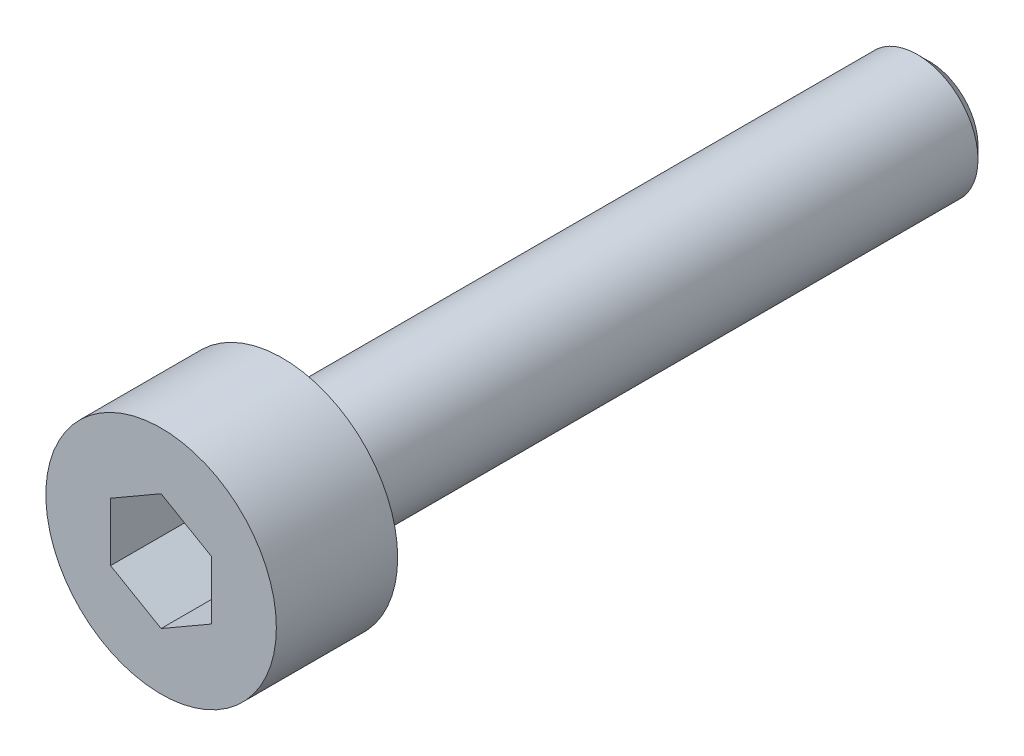
ISO-10303-21;
HEADER;
FILE_DESCRIPTION(('STEP AP214'),'2;1');
FILE_NAME('part.step','',(''),(''),'','','');
FILE_SCHEMA(('AUTOMOTIVE_DESIGN { 1 0 10303 214 1 1 1 1 }'));
ENDSEC;
DATA;
#1=APPLICATION_CONTEXT('core data for automotive mechanical design processes');
#2=APPLICATION_PROTOCOL_DEFINITION('international standard','automotive_design',2000,#1);
#3=PRODUCT_CONTEXT('',#1,'mechanical');
#4=PRODUCT('Part','Part','',(#3));
#5=PRODUCT_RELATED_PRODUCT_CATEGORY('part','',(#4));
#6=PRODUCT_DEFINITION_FORMATION('','',#4);
#7=PRODUCT_DEFINITION_CONTEXT('part definition',#1,'design');
#8=PRODUCT_DEFINITION('design','',#6,#7);
#9=PRODUCT_DEFINITION_SHAPE('','',#8);
#10=(LENGTH_UNIT() NAMED_UNIT(*) SI_UNIT(.MILLI.,.METRE.));
#11=(NAMED_UNIT(*) PLANE_ANGLE_UNIT() SI_UNIT($,.RADIAN.));
#12=(NAMED_UNIT(*) SI_UNIT($,.STERADIAN.) SOLID_ANGLE_UNIT());
#13=UNCERTAINTY_MEASURE_WITH_UNIT(LENGTH_MEASURE(1.E-05),#10,'distance_accuracy_value','');
#14=(GEOMETRIC_REPRESENTATION_CONTEXT(3) GLOBAL_UNCERTAINTY_ASSIGNED_CONTEXT((#13)) GLOBAL_UNIT_ASSIGNED_CONTEXT((#10,
#11,#12)) REPRESENTATION_CONTEXT('',''));
#15=CARTESIAN_POINT('',(0.,0.,0.));
#16=DIRECTION('',(0.,0.,1.));
#17=DIRECTION('',(1.,0.,0.));
#18=AXIS2_PLACEMENT_3D('',#15,#16,#17);
#19=CARTESIAN_POINT('',(0.,0.,0.));
#20=DIRECTION('',(0.,0.,1.));
#21=DIRECTION('',(1.,0.,0.));
#22=AXIS2_PLACEMENT_3D('',#19,#20,#21);
#23=PLANE('',#22);
#24=CARTESIAN_POINT('',(0.,0.,0.));
#25=DIRECTION('',(0.,0.,1.));
#26=DIRECTION('',(1.,0.,0.));
#27=AXIS2_PLACEMENT_3D('',#24,#25,#26);
#28=CIRCLE('',#27,2.85);
#29=CARTESIAN_POINT('',(2.85,0.,0.));
#30=VERTEX_POINT('',#29);
#31=EDGE_CURVE('E138',#30,#30,#28,.T.);
#32=ORIENTED_EDGE('',*,*,#31,.F.);
#33=EDGE_LOOP('',(#32));
#34=FACE_BOUND('',#33,.T.);
#35=CARTESIAN_POINT('',(0.,0.,0.));
#36=DIRECTION('',(0.,0.,1.));
#37=DIRECTION('',(1.,0.,0.));
#38=AXIS2_PLACEMENT_3D('',#35,#36,#37);
#39=CIRCLE('',#38,1.5);
#40=CARTESIAN_POINT('',(1.5,0.,0.));
#41=VERTEX_POINT('',#40);
#42=EDGE_CURVE('E147',#41,#41,#39,.F.);
#43=ORIENTED_EDGE('',*,*,#42,.F.);
#44=EDGE_LOOP('',(#43));
#45=FACE_BOUND('',#44,.T.);
#46=ADVANCED_FACE('F36',(#34,#45),#23,.F.);
#47=CARTESIAN_POINT('',(0.,0.,3.));
#48=DIRECTION('',(0.,0.,-1.));
#49=DIRECTION('',(-1.,0.,0.));
#50=AXIS2_PLACEMENT_3D('',#47,#48,#49);
#51=CYLINDRICAL_SURFACE('',#50,2.85);
#52=CARTESIAN_POINT('',(0.,0.,3.));
#53=DIRECTION('',(0.,0.,1.));
#54=DIRECTION('',(1.,0.,0.));
#55=AXIS2_PLACEMENT_3D('',#52,#53,#54);
#56=CIRCLE('',#55,2.85);
#57=CARTESIAN_POINT('',(2.85,0.,3.));
#58=VERTEX_POINT('',#57);
#59=EDGE_CURVE('E144',#58,#58,#56,.T.);
#60=ORIENTED_EDGE('',*,*,#59,.F.);
#61=EDGE_LOOP('',(#60));
#62=FACE_BOUND('',#61,.T.);
#63=ORIENTED_EDGE('',*,*,#31,.T.);
#64=EDGE_LOOP('',(#63));
#65=FACE_BOUND('',#64,.T.);
#66=ADVANCED_FACE('F169',(#62,#65),#51,.T.);
#67=CARTESIAN_POINT('',(0.,0.,3.));
#68=DIRECTION('',(0.,0.,1.));
#69=DIRECTION('',(1.,0.,0.));
#70=AXIS2_PLACEMENT_3D('',#67,#68,#69);
#71=PLANE('',#70);
#72=DIRECTION('',(-0.866025403784439,0.5,0.));
#73=VECTOR('',#72,1.);
#74=CARTESIAN_POINT('',(1.25,0.721687836487032,3.));
#75=LINE('',#74,#73);
#76=CARTESIAN_POINT('',(1.25,0.721687836487032,3.));
#77=VERTEX_POINT('',#76);
#78=CARTESIAN_POINT('',(0.,1.44337567297406,3.));
#79=VERTEX_POINT('',#78);
#80=EDGE_CURVE('E51',#77,#79,#75,.T.);
#81=ORIENTED_EDGE('',*,*,#80,.F.);
#82=DIRECTION('',(0.,1.,0.));
#83=VECTOR('',#82,1.);
#84=CARTESIAN_POINT('',(1.25,-0.721687836487032,3.));
#85=LINE('',#84,#83);
#86=CARTESIAN_POINT('',(1.25,-0.721687836487032,3.));
#87=VERTEX_POINT('',#86);
#88=EDGE_CURVE('E134',#87,#77,#85,.T.);
#89=ORIENTED_EDGE('',*,*,#88,.F.);
#90=DIRECTION('',(0.866025403784439,0.5,0.));
#91=VECTOR('',#90,1.);
#92=CARTESIAN_POINT('',(0.,-1.44337567297406,3.));
#93=LINE('',#92,#91);
#94=CARTESIAN_POINT('',(0.,-1.44337567297406,3.));
#95=VERTEX_POINT('',#94);
#96=EDGE_CURVE('E132',#95,#87,#93,.T.);
#97=ORIENTED_EDGE('',*,*,#96,.F.);
#98=DIRECTION('',(0.866025403784439,-0.5,0.));
#99=VECTOR('',#98,1.);
#100=CARTESIAN_POINT('',(-1.25,-0.721687836487033,3.));
#101=LINE('',#100,#99);
#102=CARTESIAN_POINT('',(-1.25,-0.721687836487033,3.));
#103=VERTEX_POINT('',#102);
#104=EDGE_CURVE('E99',#103,#95,#101,.T.);
#105=ORIENTED_EDGE('',*,*,#104,.F.);
#106=DIRECTION('',(0.,-1.,0.));
#107=VECTOR('',#106,1.);
#108=CARTESIAN_POINT('',(-1.25,0.721687836487032,3.));
#109=LINE('',#108,#107);
#110=CARTESIAN_POINT('',(-1.25,0.721687836487032,3.));
#111=VERTEX_POINT('',#110);
#112=EDGE_CURVE('E128',#111,#103,#109,.T.);
#113=ORIENTED_EDGE('',*,*,#112,.F.);
#114=DIRECTION('',(-0.866025403784439,-0.5,0.));
#115=VECTOR('',#114,1.);
#116=CARTESIAN_POINT('',(0.,1.44337567297406,3.));
#117=LINE('',#116,#115);
#118=EDGE_CURVE('E125',#79,#111,#117,.T.);
#119=ORIENTED_EDGE('',*,*,#118,.F.);
#120=EDGE_LOOP('',(#81,#89,#97,#105,#113,#119));
#121=FACE_BOUND('',#120,.T.);
#122=ORIENTED_EDGE('',*,*,#59,.T.);
#123=EDGE_LOOP('',(#122));
#124=FACE_BOUND('',#123,.T.);
#125=ADVANCED_FACE('F175',(#121,#124),#71,.T.);
#126=CARTESIAN_POINT('',(0.,0.,-16.));
#127=DIRECTION('',(0.,0.,1.));
#128=DIRECTION('',(1.,0.,0.));
#129=AXIS2_PLACEMENT_3D('',#126,#127,#128);
#130=CYLINDRICAL_SURFACE('',#129,1.5);
#131=CARTESIAN_POINT('',(0.,0.,-15.7));
#132=DIRECTION('',(0.,0.,-1.));
#133=DIRECTION('',(-1.,0.,0.));
#134=AXIS2_PLACEMENT_3D('',#131,#132,#133);
#135=CIRCLE('',#134,1.5);
#136=CARTESIAN_POINT('',(-1.5,0.,-15.7));
#137=VERTEX_POINT('',#136);
#138=EDGE_CURVE('E11',#137,#137,#135,.F.);
#139=ORIENTED_EDGE('',*,*,#138,.T.);
#140=EDGE_LOOP('',(#139));
#141=FACE_BOUND('',#140,.T.);
#142=ORIENTED_EDGE('',*,*,#42,.T.);
#143=EDGE_LOOP('',(#142));
#144=FACE_BOUND('',#143,.T.);
#145=ADVANCED_FACE('F165',(#141,#144),#130,.T.);
#146=CARTESIAN_POINT('',(0.,0.,-16.));
#147=DIRECTION('',(0.,0.,-1.));
#148=DIRECTION('',(-1.,0.,0.));
#149=AXIS2_PLACEMENT_3D('',#146,#147,#148);
#150=PLANE('',#149);
#151=CARTESIAN_POINT('',(0.,0.,-16.));
#152=DIRECTION('',(0.,0.,-1.));
#153=DIRECTION('',(-1.,0.,0.));
#154=AXIS2_PLACEMENT_3D('',#151,#152,#153);
#155=CIRCLE('',#154,1.2);
#156=CARTESIAN_POINT('',(-1.2,0.,-16.));
#157=VERTEX_POINT('',#156);
#158=EDGE_CURVE('E44',#157,#157,#155,.T.);
#159=ORIENTED_EDGE('',*,*,#158,.T.);
#160=EDGE_LOOP('',(#159));
#161=FACE_BOUND('',#160,.T.);
#162=ADVANCED_FACE('F154',(#161),#150,.T.);
#163=CARTESIAN_POINT('',(0.,0.,-16.));
#164=DIRECTION('',(0.,0.,1.));
#165=DIRECTION('',(1.,0.,0.));
#166=AXIS2_PLACEMENT_3D('',#163,#164,#165);
#167=CONICAL_SURFACE('',#166,1.2,0.785398163397455);
#168=ORIENTED_EDGE('',*,*,#138,.F.);
#169=EDGE_LOOP('',(#168));
#170=FACE_BOUND('',#169,.T.);
#171=ORIENTED_EDGE('',*,*,#158,.F.);
#172=EDGE_LOOP('',(#171));
#173=FACE_BOUND('',#172,.T.);
#174=ADVANCED_FACE('F38',(#170,#173),#167,.T.);
#175=CARTESIAN_POINT('',(1.25,0.721687836487032,1.));
#176=DIRECTION('',(0.5,0.866025403784439,0.));
#177=DIRECTION('',(-0.866025403784439,0.5,0.));
#178=AXIS2_PLACEMENT_3D('',#175,#176,#177);
#179=PLANE('',#178);
#180=ORIENTED_EDGE('',*,*,#80,.T.);
#181=DIRECTION('',(0.,0.,1.));
#182=VECTOR('',#181,1.);
#183=CARTESIAN_POINT('',(0.,1.44337567297406,1.));
#184=LINE('',#183,#182);
#185=CARTESIAN_POINT('',(0.,1.44337567297406,1.));
#186=VERTEX_POINT('',#185);
#187=EDGE_CURVE('E81',#186,#79,#184,.T.);
#188=ORIENTED_EDGE('',*,*,#187,.F.);
#189=DIRECTION('',(-0.866025403784439,0.5,0.));
#190=VECTOR('',#189,1.);
#191=CARTESIAN_POINT('',(1.25,0.721687836487032,1.));
#192=LINE('',#191,#190);
#193=CARTESIAN_POINT('',(1.25,0.721687836487032,1.));
#194=VERTEX_POINT('',#193);
#195=EDGE_CURVE('E136',#194,#186,#192,.T.);
#196=ORIENTED_EDGE('',*,*,#195,.F.);
#197=DIRECTION('',(0.,0.,1.));
#198=VECTOR('',#197,1.);
#199=CARTESIAN_POINT('',(1.25,0.721687836487032,1.));
#200=LINE('',#199,#198);
#201=EDGE_CURVE('E59',#194,#77,#200,.T.);
#202=ORIENTED_EDGE('',*,*,#201,.T.);
#203=EDGE_LOOP('',(#180,#188,#196,#202));
#204=FACE_BOUND('',#203,.T.);
#205=ADVANCED_FACE('F157',(#204),#179,.F.);
#206=CARTESIAN_POINT('',(1.25,-0.721687836487032,1.));
#207=DIRECTION('',(1.,0.,0.));
#208=DIRECTION('',(0.,1.,0.));
#209=AXIS2_PLACEMENT_3D('',#206,#207,#208);
#210=PLANE('',#209);
#211=ORIENTED_EDGE('',*,*,#88,.T.);
#212=ORIENTED_EDGE('',*,*,#201,.F.);
#213=DIRECTION('',(0.,1.,0.));
#214=VECTOR('',#213,1.);
#215=CARTESIAN_POINT('',(1.25,-0.721687836487032,1.));
#216=LINE('',#215,#214);
#217=CARTESIAN_POINT('',(1.25,-0.721687836487032,1.));
#218=VERTEX_POINT('',#217);
#219=EDGE_CURVE('E111',#218,#194,#216,.T.);
#220=ORIENTED_EDGE('',*,*,#219,.F.);
#221=DIRECTION('',(0.,0.,1.));
#222=VECTOR('',#221,1.);
#223=CARTESIAN_POINT('',(1.25,-0.721687836487032,1.));
#224=LINE('',#223,#222);
#225=EDGE_CURVE('E103',#218,#87,#224,.T.);
#226=ORIENTED_EDGE('',*,*,#225,.T.);
#227=EDGE_LOOP('',(#211,#212,#220,#226));
#228=FACE_BOUND('',#227,.T.);
#229=ADVANCED_FACE('F163',(#228),#210,.F.);
#230=CARTESIAN_POINT('',(0.,-1.44337567297406,1.));
#231=DIRECTION('',(0.5,-0.866025403784439,0.));
#232=DIRECTION('',(0.866025403784439,0.5,0.));
#233=AXIS2_PLACEMENT_3D('',#230,#231,#232);
#234=PLANE('',#233);
#235=ORIENTED_EDGE('',*,*,#96,.T.);
#236=ORIENTED_EDGE('',*,*,#225,.F.);
#237=DIRECTION('',(0.866025403784439,0.5,0.));
#238=VECTOR('',#237,1.);
#239=CARTESIAN_POINT('',(0.,-1.44337567297406,1.));
#240=LINE('',#239,#238);
#241=CARTESIAN_POINT('',(0.,-1.44337567297406,1.));
#242=VERTEX_POINT('',#241);
#243=EDGE_CURVE('E107',#242,#218,#240,.T.);
#244=ORIENTED_EDGE('',*,*,#243,.F.);
#245=DIRECTION('',(0.,0.,1.));
#246=VECTOR('',#245,1.);
#247=CARTESIAN_POINT('',(0.,-1.44337567297406,1.));
#248=LINE('',#247,#246);
#249=EDGE_CURVE('E92',#242,#95,#248,.T.);
#250=ORIENTED_EDGE('',*,*,#249,.T.);
#251=EDGE_LOOP('',(#235,#236,#244,#250));
#252=FACE_BOUND('',#251,.T.);
#253=ADVANCED_FACE('F108',(#252),#234,.F.);
#254=CARTESIAN_POINT('',(-1.25,-0.721687836487033,1.));
#255=DIRECTION('',(-0.5,-0.866025403784439,0.));
#256=DIRECTION('',(0.866025403784439,-0.5,0.));
#257=AXIS2_PLACEMENT_3D('',#254,#255,#256);
#258=PLANE('',#257);
#259=ORIENTED_EDGE('',*,*,#104,.T.);
#260=ORIENTED_EDGE('',*,*,#249,.F.);
#261=DIRECTION('',(0.866025403784439,-0.5,0.));
#262=VECTOR('',#261,1.);
#263=CARTESIAN_POINT('',(-1.25,-0.721687836487033,1.));
#264=LINE('',#263,#262);
#265=CARTESIAN_POINT('',(-1.25,-0.721687836487033,1.));
#266=VERTEX_POINT('',#265);
#267=EDGE_CURVE('E96',#266,#242,#264,.T.);
#268=ORIENTED_EDGE('',*,*,#267,.F.);
#269=DIRECTION('',(0.,0.,1.));
#270=VECTOR('',#269,1.);
#271=CARTESIAN_POINT('',(-1.25,-0.721687836487033,1.));
#272=LINE('',#271,#270);
#273=EDGE_CURVE('E104',#266,#103,#272,.T.);
#274=ORIENTED_EDGE('',*,*,#273,.T.);
#275=EDGE_LOOP('',(#259,#260,#268,#274));
#276=FACE_BOUND('',#275,.T.);
#277=ADVANCED_FACE('F94',(#276),#258,.F.);
#278=CARTESIAN_POINT('',(-1.25,0.721687836487032,1.));
#279=DIRECTION('',(-1.,0.,0.));
#280=DIRECTION('',(0.,0.,1.));
#281=AXIS2_PLACEMENT_3D('',#278,#279,#280);
#282=PLANE('',#281);
#283=ORIENTED_EDGE('',*,*,#112,.T.);
#284=ORIENTED_EDGE('',*,*,#273,.F.);
#285=DIRECTION('',(0.,-1.,0.));
#286=VECTOR('',#285,1.);
#287=CARTESIAN_POINT('',(-1.25,0.721687836487032,1.));
#288=LINE('',#287,#286);
#289=CARTESIAN_POINT('',(-1.25,0.721687836487032,1.));
#290=VERTEX_POINT('',#289);
#291=EDGE_CURVE('E117',#290,#266,#288,.T.);
#292=ORIENTED_EDGE('',*,*,#291,.F.);
#293=DIRECTION('',(0.,0.,1.));
#294=VECTOR('',#293,1.);
#295=CARTESIAN_POINT('',(-1.25,0.721687836487032,1.));
#296=LINE('',#295,#294);
#297=EDGE_CURVE('E141',#290,#111,#296,.T.);
#298=ORIENTED_EDGE('',*,*,#297,.T.);
#299=EDGE_LOOP('',(#283,#284,#292,#298));
#300=FACE_BOUND('',#299,.T.);
#301=ADVANCED_FACE('F189',(#300),#282,.F.);
#302=CARTESIAN_POINT('',(0.,1.44337567297406,1.));
#303=DIRECTION('',(-0.5,0.866025403784439,0.));
#304=DIRECTION('',(-0.866025403784439,-0.5,0.));
#305=AXIS2_PLACEMENT_3D('',#302,#303,#304);
#306=PLANE('',#305);
#307=ORIENTED_EDGE('',*,*,#118,.T.);
#308=ORIENTED_EDGE('',*,*,#297,.F.);
#309=DIRECTION('',(-0.866025403784439,-0.5,0.));
#310=VECTOR('',#309,1.);
#311=CARTESIAN_POINT('',(0.,1.44337567297406,1.));
#312=LINE('',#311,#310);
#313=EDGE_CURVE('E119',#186,#290,#312,.T.);
#314=ORIENTED_EDGE('',*,*,#313,.F.);
#315=ORIENTED_EDGE('',*,*,#187,.T.);
#316=EDGE_LOOP('',(#307,#308,#314,#315));
#317=FACE_BOUND('',#316,.T.);
#318=ADVANCED_FACE('F186',(#317),#306,.F.);
#319=CARTESIAN_POINT('',(0.,0.,1.));
#320=DIRECTION('',(0.,0.,1.));
#321=DIRECTION('',(1.,0.,0.));
#322=AXIS2_PLACEMENT_3D('',#319,#320,#321);
#323=PLANE('',#322);
#324=ORIENTED_EDGE('',*,*,#195,.T.);
#325=ORIENTED_EDGE('',*,*,#313,.T.);
#326=ORIENTED_EDGE('',*,*,#291,.T.);
#327=ORIENTED_EDGE('',*,*,#267,.T.);
#328=ORIENTED_EDGE('',*,*,#243,.T.);
#329=ORIENTED_EDGE('',*,*,#219,.T.);
#330=EDGE_LOOP('',(#324,#325,#326,#327,#328,#329));
#331=FACE_BOUND('',#330,.T.);
#332=ADVANCED_FACE('F114',(#331),#323,.T.);
#333=CLOSED_SHELL('',(#46,#66,#125,#145,#162,#174,#205,#229,#253,#277,#301,#318,#332));
#334=MANIFOLD_SOLID_BREP('B2',#333);
#335=ADVANCED_BREP_SHAPE_REPRESENTATION('',(#18,#334),#14);
#336=SHAPE_DEFINITION_REPRESENTATION(#9,#335);
ENDSEC;
END-ISO-10303-21;
